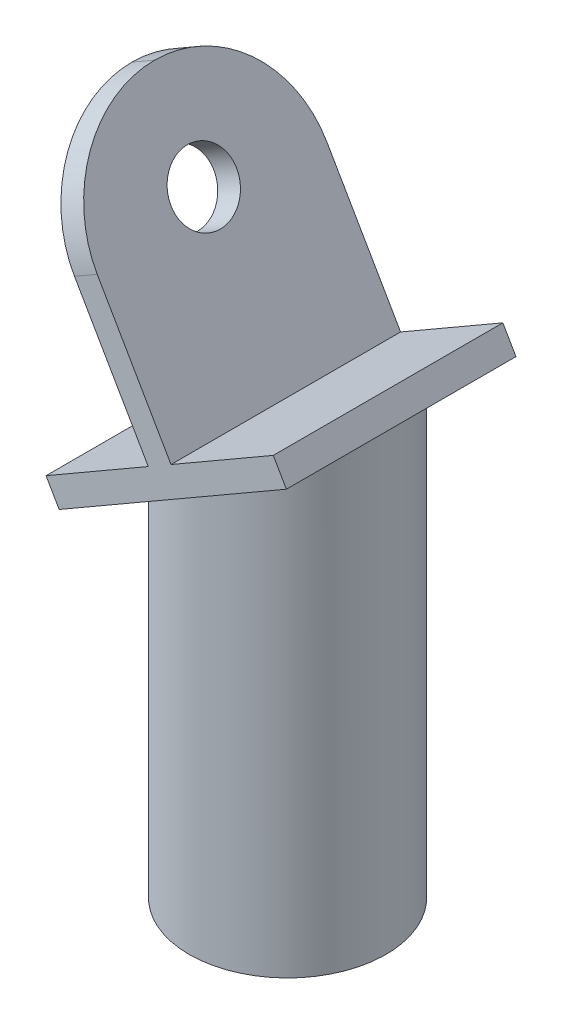
ISO-10303-21;
HEADER;
FILE_DESCRIPTION(('STEP AP214'),'2;1');
FILE_NAME('part.step','',(''),(''),'','','');
FILE_SCHEMA(('AUTOMOTIVE_DESIGN { 1 0 10303 214 1 1 1 1 }'));
ENDSEC;
DATA;
#1=APPLICATION_CONTEXT('core data for automotive mechanical design processes');
#2=APPLICATION_PROTOCOL_DEFINITION('international standard','automotive_design',2000,#1);
#3=PRODUCT_CONTEXT('',#1,'mechanical');
#4=PRODUCT('Part','Part','',(#3));
#5=PRODUCT_RELATED_PRODUCT_CATEGORY('part','',(#4));
#6=PRODUCT_DEFINITION_FORMATION('','',#4);
#7=PRODUCT_DEFINITION_CONTEXT('part definition',#1,'design');
#8=PRODUCT_DEFINITION('design','',#6,#7);
#9=PRODUCT_DEFINITION_SHAPE('','',#8);
#10=(LENGTH_UNIT() NAMED_UNIT(*) SI_UNIT(.MILLI.,.METRE.));
#11=(NAMED_UNIT(*) PLANE_ANGLE_UNIT() SI_UNIT($,.RADIAN.));
#12=(NAMED_UNIT(*) SI_UNIT($,.STERADIAN.) SOLID_ANGLE_UNIT());
#13=UNCERTAINTY_MEASURE_WITH_UNIT(LENGTH_MEASURE(1.E-05),#10,'distance_accuracy_value','');
#14=(GEOMETRIC_REPRESENTATION_CONTEXT(3) GLOBAL_UNCERTAINTY_ASSIGNED_CONTEXT((#13)) GLOBAL_UNIT_ASSIGNED_CONTEXT((#10,
#11,#12)) REPRESENTATION_CONTEXT('',''));
#15=CARTESIAN_POINT('',(0.,0.,0.));
#16=DIRECTION('',(0.,0.,1.));
#17=DIRECTION('',(1.,0.,0.));
#18=AXIS2_PLACEMENT_3D('',#15,#16,#17);
#19=CARTESIAN_POINT('',(-28.5608891324554,49.4689110867544,0.));
#20=DIRECTION('',(-0.500000000000001,0.866025403784438,0.));
#21=DIRECTION('',(-0.866025403784438,-0.500000000000001,0.));
#22=AXIS2_PLACEMENT_3D('',#19,#20,#21);
#23=PLANE('',#22);
#24=DIRECTION('',(0.866025403784438,0.500000000000001,0.));
#25=VECTOR('',#24,1.);
#26=CARTESIAN_POINT('',(-19.3205080756888,54.8038475772933,17.5));
#27=LINE('',#26,#25);
#28=CARTESIAN_POINT('',(-19.3205080756888,54.8038475772933,17.5));
#29=VERTEX_POINT('',#28);
#30=CARTESIAN_POINT('',(-3.73205080756885,63.8038475772934,17.5));
#31=VERTEX_POINT('',#30);
#32=EDGE_CURVE('E121',#29,#31,#27,.T.);
#33=ORIENTED_EDGE('',*,*,#32,.T.);
#34=DIRECTION('',(0.,0.,1.));
#35=VECTOR('',#34,1.);
#36=CARTESIAN_POINT('',(-3.73205080756893,63.8038475772934,-17.5));
#37=LINE('',#36,#35);
#38=CARTESIAN_POINT('',(-3.73205080756893,63.8038475772934,-17.5));
#39=VERTEX_POINT('',#38);
#40=EDGE_CURVE('E103',#39,#31,#37,.T.);
#41=ORIENTED_EDGE('',*,*,#40,.F.);
#42=DIRECTION('',(-0.866025403784438,-0.500000000000001,0.));
#43=VECTOR('',#42,1.);
#44=CARTESIAN_POINT('',(-19.3205080756888,54.8038475772933,-17.5));
#45=LINE('',#44,#43);
#46=CARTESIAN_POINT('',(-19.3205080756888,54.8038475772933,-17.5));
#47=VERTEX_POINT('',#46);
#48=EDGE_CURVE('E110',#39,#47,#45,.T.);
#49=ORIENTED_EDGE('',*,*,#48,.T.);
#50=DIRECTION('',(0.,0.,1.));
#51=VECTOR('',#50,1.);
#52=CARTESIAN_POINT('',(-19.3205080756888,54.8038475772933,-17.5));
#53=LINE('',#52,#51);
#54=EDGE_CURVE('E141',#47,#29,#53,.T.);
#55=ORIENTED_EDGE('',*,*,#54,.T.);
#56=EDGE_LOOP('',(#33,#41,#49,#55));
#57=FACE_BOUND('',#56,.T.);
#58=ADVANCED_FACE('F33',(#57),#23,.T.);
#59=CARTESIAN_POINT('',(15.3205080756887,74.8038475772934,-17.5));
#60=VERTEX_POINT('',#59);
#61=CARTESIAN_POINT('',(-0.267949192431165,65.8038475772933,-17.5));
#62=VERTEX_POINT('',#61);
#63=EDGE_CURVE('E116',#60,#62,#45,.T.);
#64=ORIENTED_EDGE('',*,*,#63,.T.);
#65=DIRECTION('',(0.,0.,-1.));
#66=VECTOR('',#65,1.);
#67=CARTESIAN_POINT('',(-0.267949192431172,65.8038475772934,-17.5));
#68=LINE('',#67,#66);
#69=CARTESIAN_POINT('',(-0.26794919243114,65.8038475772934,17.5));
#70=VERTEX_POINT('',#69);
#71=EDGE_CURVE('E107',#70,#62,#68,.T.);
#72=ORIENTED_EDGE('',*,*,#71,.F.);
#73=CARTESIAN_POINT('',(15.3205080756887,74.8038475772934,17.5));
#74=VERTEX_POINT('',#73);
#75=EDGE_CURVE('E143',#70,#74,#27,.T.);
#76=ORIENTED_EDGE('',*,*,#75,.T.);
#77=DIRECTION('',(0.,0.,-1.));
#78=VECTOR('',#77,1.);
#79=CARTESIAN_POINT('',(15.3205080756887,74.8038475772934,-17.5));
#80=LINE('',#79,#78);
#81=EDGE_CURVE('E117',#74,#60,#80,.T.);
#82=ORIENTED_EDGE('',*,*,#81,.T.);
#83=EDGE_LOOP('',(#64,#72,#76,#82));
#84=FACE_BOUND('',#83,.T.);
#85=ADVANCED_FACE('F215',(#84),#23,.T.);
#86=CARTESIAN_POINT('',(0.,70.,0.));
#87=DIRECTION('',(0.,-1.,0.));
#88=DIRECTION('',(0.,0.,-1.));
#89=AXIS2_PLACEMENT_3D('',#86,#87,#88);
#90=CYLINDRICAL_SURFACE('',#89,15.);
#91=CARTESIAN_POINT('',(0.,0.,0.));
#92=DIRECTION('',(0.,1.,0.));
#93=DIRECTION('',(0.,0.,1.));
#94=AXIS2_PLACEMENT_3D('',#91,#92,#93);
#95=CIRCLE('',#94,15.);
#96=CARTESIAN_POINT('',(0.,0.,15.));
#97=VERTEX_POINT('',#96);
#98=EDGE_CURVE('E171',#97,#97,#95,.T.);
#99=ORIENTED_EDGE('',*,*,#98,.T.);
#100=EDGE_LOOP('',(#99));
#101=FACE_BOUND('',#100,.T.);
#102=CARTESIAN_POINT('',(0.,61.3397459621556,0.));
#103=DIRECTION('',(-0.500000000000001,0.866025403784438,0.));
#104=DIRECTION('',(-0.866025403784438,-0.500000000000001,0.));
#105=AXIS2_PLACEMENT_3D('',#102,#103,#104);
#106=ELLIPSE('',#105,17.3205080756888,15.);
#107=CARTESIAN_POINT('',(-15.,52.6794919243112,0.));
#108=VERTEX_POINT('',#107);
#109=EDGE_CURVE('E165',#108,#108,#106,.T.);
#110=ORIENTED_EDGE('',*,*,#109,.F.);
#111=EDGE_LOOP('',(#110));
#112=FACE_BOUND('',#111,.T.);
#113=ADVANCED_FACE('F219',(#101,#112),#90,.T.);
#114=CARTESIAN_POINT('',(0.,70.,0.));
#115=DIRECTION('',(0.,-1.,0.));
#116=DIRECTION('',(0.,0.,-1.));
#117=AXIS2_PLACEMENT_3D('',#114,#115,#116);
#118=CYLINDRICAL_SURFACE('',#117,13.);
#119=CARTESIAN_POINT('',(0.,0.,0.));
#120=DIRECTION('',(0.,1.,0.));
#121=DIRECTION('',(0.,0.,1.));
#122=AXIS2_PLACEMENT_3D('',#119,#120,#121);
#123=CIRCLE('',#122,13.);
#124=CARTESIAN_POINT('',(0.,0.,13.));
#125=VERTEX_POINT('',#124);
#126=EDGE_CURVE('E168',#125,#125,#123,.T.);
#127=ORIENTED_EDGE('',*,*,#126,.F.);
#128=EDGE_LOOP('',(#127));
#129=FACE_BOUND('',#128,.T.);
#130=CARTESIAN_POINT('',(0.,61.3397459621556,0.));
#131=DIRECTION('',(-0.500000000000001,0.866025403784438,0.));
#132=DIRECTION('',(-0.866025403784438,-0.500000000000001,0.));
#133=AXIS2_PLACEMENT_3D('',#130,#131,#132);
#134=ELLIPSE('',#133,15.0111069989303,13.);
#135=CARTESIAN_POINT('',(-13.,53.8341924626905,0.));
#136=VERTEX_POINT('',#135);
#137=EDGE_CURVE('E162',#136,#136,#134,.T.);
#138=ORIENTED_EDGE('',*,*,#137,.T.);
#139=EDGE_LOOP('',(#138));
#140=FACE_BOUND('',#139,.T.);
#141=ADVANCED_FACE('F234',(#129,#140),#118,.F.);
#142=CARTESIAN_POINT('',(0.,0.,0.));
#143=DIRECTION('',(0.,1.,0.));
#144=DIRECTION('',(0.,0.,1.));
#145=AXIS2_PLACEMENT_3D('',#142,#143,#144);
#146=PLANE('',#145);
#147=ORIENTED_EDGE('',*,*,#98,.F.);
#148=EDGE_LOOP('',(#147));
#149=FACE_BOUND('',#148,.T.);
#150=ORIENTED_EDGE('',*,*,#126,.T.);
#151=EDGE_LOOP('',(#150));
#152=FACE_BOUND('',#151,.T.);
#153=ADVANCED_FACE('F237',(#149,#152),#146,.F.);
#154=CARTESIAN_POINT('',(-26.5608891324554,46.0048094716166,0.));
#155=DIRECTION('',(-0.500000000000001,0.866025403784438,0.));
#156=DIRECTION('',(-0.866025403784438,-0.500000000000001,0.));
#157=AXIS2_PLACEMENT_3D('',#154,#155,#156);
#158=PLANE('',#157);
#159=ORIENTED_EDGE('',*,*,#137,.F.);
#160=EDGE_LOOP('',(#159));
#161=FACE_BOUND('',#160,.T.);
#162=ADVANCED_FACE('F212',(#161),#158,.F.);
#163=CARTESIAN_POINT('',(15.3205080756887,74.8038475772934,-17.5));
#164=DIRECTION('',(-0.866025403784438,-0.500000000000001,0.));
#165=DIRECTION('',(0.500000000000001,-0.866025403784438,0.));
#166=AXIS2_PLACEMENT_3D('',#163,#164,#165);
#167=PLANE('',#166);
#168=DIRECTION('',(0.,0.,-1.));
#169=VECTOR('',#168,1.);
#170=CARTESIAN_POINT('',(17.3205080756887,71.3397459621556,-17.5));
#171=LINE('',#170,#169);
#172=CARTESIAN_POINT('',(17.3205080756888,71.3397459621556,17.5));
#173=VERTEX_POINT('',#172);
#174=CARTESIAN_POINT('',(17.3205080756887,71.3397459621556,-17.5));
#175=VERTEX_POINT('',#174);
#176=EDGE_CURVE('E136',#173,#175,#171,.T.);
#177=ORIENTED_EDGE('',*,*,#176,.T.);
#178=DIRECTION('',(0.500000000000001,-0.866025403784438,0.));
#179=VECTOR('',#178,1.);
#180=CARTESIAN_POINT('',(15.3205080756887,74.8038475772934,-17.5));
#181=LINE('',#180,#179);
#182=EDGE_CURVE('E159',#60,#175,#181,.T.);
#183=ORIENTED_EDGE('',*,*,#182,.F.);
#184=ORIENTED_EDGE('',*,*,#81,.F.);
#185=DIRECTION('',(0.500000000000001,-0.866025403784438,0.));
#186=VECTOR('',#185,1.);
#187=CARTESIAN_POINT('',(15.3205080756887,74.8038475772934,17.5));
#188=LINE('',#187,#186);
#189=EDGE_CURVE('E145',#74,#173,#188,.T.);
#190=ORIENTED_EDGE('',*,*,#189,.T.);
#191=EDGE_LOOP('',(#177,#183,#184,#190));
#192=FACE_BOUND('',#191,.T.);
#193=ADVANCED_FACE('F230',(#192),#167,.F.);
#194=CARTESIAN_POINT('',(-19.3205080756888,54.8038475772933,-17.5));
#195=DIRECTION('',(0.,0.,1.));
#196=DIRECTION('',(1.,0.,0.));
#197=AXIS2_PLACEMENT_3D('',#194,#195,#196);
#198=PLANE('',#197);
#199=DIRECTION('',(0.500000000000001,-0.866025403784438,0.));
#200=VECTOR('',#199,1.);
#201=CARTESIAN_POINT('',(-23.732050807569,98.4448637286709,-17.5));
#202=LINE('',#201,#200);
#203=CARTESIAN_POINT('',(-14.982050807569,83.2894191624433,-17.5));
#204=VERTEX_POINT('',#203);
#205=EDGE_CURVE('E99',#204,#39,#202,.T.);
#206=ORIENTED_EDGE('',*,*,#205,.F.);
#207=DIRECTION('',(-0.866025403784438,-0.500000000000001,0.));
#208=VECTOR('',#207,1.);
#209=CARTESIAN_POINT('',(-30.5705080756888,74.2894191624433,-17.5));
#210=LINE('',#209,#208);
#211=CARTESIAN_POINT('',(-11.5179491924312,85.2894191624433,-17.5));
#212=VERTEX_POINT('',#211);
#213=EDGE_CURVE('E11',#204,#212,#210,.F.);
#214=ORIENTED_EDGE('',*,*,#213,.T.);
#215=DIRECTION('',(0.500000000000001,-0.866025403784438,0.));
#216=VECTOR('',#215,1.);
#217=CARTESIAN_POINT('',(-20.2679491924312,100.444863728671,-17.5));
#218=LINE('',#217,#216);
#219=EDGE_CURVE('E106',#212,#62,#218,.T.);
#220=ORIENTED_EDGE('',*,*,#219,.T.);
#221=ORIENTED_EDGE('',*,*,#63,.F.);
#222=ORIENTED_EDGE('',*,*,#182,.T.);
#223=DIRECTION('',(-0.866025403784438,-0.500000000000001,0.));
#224=VECTOR('',#223,1.);
#225=CARTESIAN_POINT('',(-17.3205080756888,51.3397459621556,-17.5));
#226=LINE('',#225,#224);
#227=CARTESIAN_POINT('',(-17.3205080756888,51.3397459621556,-17.5));
#228=VERTEX_POINT('',#227);
#229=EDGE_CURVE('E148',#175,#228,#226,.T.);
#230=ORIENTED_EDGE('',*,*,#229,.T.);
#231=DIRECTION('',(0.500000000000001,-0.866025403784438,0.));
#232=VECTOR('',#231,1.);
#233=CARTESIAN_POINT('',(-19.3205080756888,54.8038475772933,-17.5));
#234=LINE('',#233,#232);
#235=EDGE_CURVE('E113',#47,#228,#234,.T.);
#236=ORIENTED_EDGE('',*,*,#235,.F.);
#237=ORIENTED_EDGE('',*,*,#48,.F.);
#238=EDGE_LOOP('',(#206,#214,#220,#221,#222,#230,#236,#237));
#239=FACE_BOUND('',#238,.T.);
#240=ADVANCED_FACE('F111',(#239),#198,.F.);
#241=CARTESIAN_POINT('',(-19.3205080756888,54.8038475772933,-17.5));
#242=DIRECTION('',(0.866025403784438,0.500000000000001,0.));
#243=DIRECTION('',(-0.500000000000001,0.866025403784438,0.));
#244=AXIS2_PLACEMENT_3D('',#241,#242,#243);
#245=PLANE('',#244);
#246=DIRECTION('',(0.,0.,1.));
#247=VECTOR('',#246,1.);
#248=CARTESIAN_POINT('',(-17.3205080756888,51.3397459621556,-17.5));
#249=LINE('',#248,#247);
#250=CARTESIAN_POINT('',(-17.3205080756888,51.3397459621556,17.5));
#251=VERTEX_POINT('',#250);
#252=EDGE_CURVE('E150',#228,#251,#249,.T.);
#253=ORIENTED_EDGE('',*,*,#252,.T.);
#254=DIRECTION('',(0.500000000000001,-0.866025403784438,0.));
#255=VECTOR('',#254,1.);
#256=CARTESIAN_POINT('',(-19.3205080756888,54.8038475772933,17.5));
#257=LINE('',#256,#255);
#258=EDGE_CURVE('E155',#29,#251,#257,.T.);
#259=ORIENTED_EDGE('',*,*,#258,.F.);
#260=ORIENTED_EDGE('',*,*,#54,.F.);
#261=ORIENTED_EDGE('',*,*,#235,.T.);
#262=EDGE_LOOP('',(#253,#259,#260,#261));
#263=FACE_BOUND('',#262,.T.);
#264=ADVANCED_FACE('F224',(#263),#245,.F.);
#265=CARTESIAN_POINT('',(-19.3205080756888,54.8038475772933,17.5));
#266=DIRECTION('',(0.,0.,-1.));
#267=DIRECTION('',(-1.,0.,0.));
#268=AXIS2_PLACEMENT_3D('',#265,#266,#267);
#269=PLANE('',#268);
#270=DIRECTION('',(0.500000000000001,-0.866025403784438,0.));
#271=VECTOR('',#270,1.);
#272=CARTESIAN_POINT('',(-20.2679491924312,100.444863728671,17.5));
#273=LINE('',#272,#271);
#274=CARTESIAN_POINT('',(-11.5179491924312,85.2894191624433,17.5));
#275=VERTEX_POINT('',#274);
#276=EDGE_CURVE('E132',#275,#70,#273,.T.);
#277=ORIENTED_EDGE('',*,*,#276,.F.);
#278=DIRECTION('',(0.866025403784438,0.500000000000001,0.));
#279=VECTOR('',#278,1.);
#280=CARTESIAN_POINT('',(-30.5705080756888,74.2894191624433,17.5));
#281=LINE('',#280,#279);
#282=CARTESIAN_POINT('',(-14.982050807569,83.2894191624433,17.5));
#283=VERTEX_POINT('',#282);
#284=EDGE_CURVE('E178',#275,#283,#281,.F.);
#285=ORIENTED_EDGE('',*,*,#284,.T.);
#286=DIRECTION('',(0.500000000000001,-0.866025403784438,0.));
#287=VECTOR('',#286,1.);
#288=CARTESIAN_POINT('',(-23.732050807569,98.4448637286709,17.5));
#289=LINE('',#288,#287);
#290=EDGE_CURVE('E134',#283,#31,#289,.T.);
#291=ORIENTED_EDGE('',*,*,#290,.T.);
#292=ORIENTED_EDGE('',*,*,#32,.F.);
#293=ORIENTED_EDGE('',*,*,#258,.T.);
#294=DIRECTION('',(0.866025403784438,0.500000000000001,0.));
#295=VECTOR('',#294,1.);
#296=CARTESIAN_POINT('',(-17.3205080756888,51.3397459621556,17.5));
#297=LINE('',#296,#295);
#298=EDGE_CURVE('E138',#251,#173,#297,.T.);
#299=ORIENTED_EDGE('',*,*,#298,.T.);
#300=ORIENTED_EDGE('',*,*,#189,.F.);
#301=ORIENTED_EDGE('',*,*,#75,.F.);
#302=EDGE_LOOP('',(#277,#285,#291,#292,#293,#299,#300,#301));
#303=FACE_BOUND('',#302,.T.);
#304=ADVANCED_FACE('F185',(#303),#269,.F.);
#305=ORIENTED_EDGE('',*,*,#109,.T.);
#306=EDGE_LOOP('',(#305));
#307=FACE_BOUND('',#306,.T.);
#308=ORIENTED_EDGE('',*,*,#176,.F.);
#309=ORIENTED_EDGE('',*,*,#298,.F.);
#310=ORIENTED_EDGE('',*,*,#252,.F.);
#311=ORIENTED_EDGE('',*,*,#229,.F.);
#312=EDGE_LOOP('',(#308,#309,#310,#311));
#313=FACE_BOUND('',#312,.T.);
#314=ADVANCED_FACE('F202',(#307,#313),#158,.F.);
#315=CARTESIAN_POINT('',(-23.732050807569,98.4448637286709,-17.5));
#316=DIRECTION('',(0.866025403784438,0.500000000000001,0.));
#317=DIRECTION('',(-0.500000000000001,0.866025403784438,0.));
#318=AXIS2_PLACEMENT_3D('',#315,#316,#317);
#319=PLANE('',#318);
#320=CARTESIAN_POINT('',(-16.232050807569,85.4544826719044,0.));
#321=DIRECTION('',(-0.866025403784438,-0.500000000000001,0.));
#322=DIRECTION('',(0.500000000000001,-0.866025403784438,0.));
#323=AXIS2_PLACEMENT_3D('',#320,#321,#322);
#324=CIRCLE('',#323,5.);
#325=CARTESIAN_POINT('',(-13.7320508075689,81.1243556529822,0.));
#326=VERTEX_POINT('',#325);
#327=EDGE_CURVE('E127',#326,#326,#324,.T.);
#328=ORIENTED_EDGE('',*,*,#327,.F.);
#329=EDGE_LOOP('',(#328));
#330=FACE_BOUND('',#329,.T.);
#331=ORIENTED_EDGE('',*,*,#290,.F.);
#332=CARTESIAN_POINT('',(-14.982050807569,83.2894191624433,0.));
#333=DIRECTION('',(0.866025403784438,0.500000000000001,0.));
#334=DIRECTION('',(-0.500000000000001,0.866025403784438,0.));
#335=AXIS2_PLACEMENT_3D('',#332,#333,#334);
#336=CIRCLE('',#335,17.5);
#337=CARTESIAN_POINT('',(-23.732050807569,98.4448637286709,0.));
#338=VERTEX_POINT('',#337);
#339=EDGE_CURVE('E42',#283,#338,#336,.F.);
#340=ORIENTED_EDGE('',*,*,#339,.T.);
#341=CARTESIAN_POINT('',(-14.982050807569,83.2894191624433,0.));
#342=DIRECTION('',(0.866025403784438,0.500000000000001,0.));
#343=DIRECTION('',(-0.500000000000001,0.866025403784438,0.));
#344=AXIS2_PLACEMENT_3D('',#341,#342,#343);
#345=CIRCLE('',#344,17.5);
#346=EDGE_CURVE('E49',#338,#204,#345,.F.);
#347=ORIENTED_EDGE('',*,*,#346,.T.);
#348=ORIENTED_EDGE('',*,*,#205,.T.);
#349=ORIENTED_EDGE('',*,*,#40,.T.);
#350=EDGE_LOOP('',(#331,#340,#347,#348,#349));
#351=FACE_BOUND('',#350,.T.);
#352=ADVANCED_FACE('F101',(#330,#351),#319,.F.);
#353=CARTESIAN_POINT('',(-20.2679491924312,100.444863728671,-17.5));
#354=DIRECTION('',(-0.866025403784438,-0.500000000000001,0.));
#355=DIRECTION('',(0.500000000000001,-0.866025403784438,0.));
#356=AXIS2_PLACEMENT_3D('',#353,#354,#355);
#357=PLANE('',#356);
#358=CARTESIAN_POINT('',(-12.7679491924312,87.4544826719044,0.));
#359=DIRECTION('',(-0.866025403784438,-0.500000000000001,0.));
#360=DIRECTION('',(0.500000000000001,-0.866025403784438,0.));
#361=AXIS2_PLACEMENT_3D('',#358,#359,#360);
#362=CIRCLE('',#361,5.);
#363=CARTESIAN_POINT('',(-10.2679491924312,83.1243556529822,0.));
#364=VERTEX_POINT('',#363);
#365=EDGE_CURVE('E122',#364,#364,#362,.T.);
#366=ORIENTED_EDGE('',*,*,#365,.T.);
#367=EDGE_LOOP('',(#366));
#368=FACE_BOUND('',#367,.T.);
#369=CARTESIAN_POINT('',(-11.5179491924312,85.2894191624433,0.));
#370=DIRECTION('',(-0.866025403784438,-0.500000000000001,0.));
#371=DIRECTION('',(0.500000000000001,-0.866025403784438,0.));
#372=AXIS2_PLACEMENT_3D('',#369,#370,#371);
#373=CIRCLE('',#372,17.5);
#374=CARTESIAN_POINT('',(-20.2679491924312,100.444863728671,0.));
#375=VERTEX_POINT('',#374);
#376=EDGE_CURVE('E173',#212,#375,#373,.F.);
#377=ORIENTED_EDGE('',*,*,#376,.T.);
#378=CARTESIAN_POINT('',(-11.5179491924312,85.2894191624433,0.));
#379=DIRECTION('',(-0.866025403784438,-0.500000000000001,0.));
#380=DIRECTION('',(0.500000000000001,-0.866025403784438,0.));
#381=AXIS2_PLACEMENT_3D('',#378,#379,#380);
#382=CIRCLE('',#381,17.5);
#383=EDGE_CURVE('E176',#375,#275,#382,.F.);
#384=ORIENTED_EDGE('',*,*,#383,.T.);
#385=ORIENTED_EDGE('',*,*,#276,.T.);
#386=ORIENTED_EDGE('',*,*,#71,.T.);
#387=ORIENTED_EDGE('',*,*,#219,.F.);
#388=EDGE_LOOP('',(#377,#384,#385,#386,#387));
#389=FACE_BOUND('',#388,.T.);
#390=ADVANCED_FACE('F201',(#368,#389),#357,.F.);
#391=CARTESIAN_POINT('',(15.4233937586587,103.730762113533,0.));
#392=DIRECTION('',(-0.866025403784438,-0.500000000000001,0.));
#393=DIRECTION('',(0.500000000000001,-0.866025403784438,0.));
#394=AXIS2_PLACEMENT_3D('',#391,#392,#393);
#395=CYLINDRICAL_SURFACE('',#394,5.);
#396=ORIENTED_EDGE('',*,*,#327,.T.);
#397=EDGE_LOOP('',(#396));
#398=FACE_BOUND('',#397,.T.);
#399=ORIENTED_EDGE('',*,*,#365,.F.);
#400=EDGE_LOOP('',(#399));
#401=FACE_BOUND('',#400,.T.);
#402=ADVANCED_FACE('F197',(#398,#401),#395,.F.);
#403=CARTESIAN_POINT('',(-39.8108891324554,68.9544826719043,0.));
#404=DIRECTION('',(-0.866025403784438,-0.500000000000001,0.));
#405=DIRECTION('',(0.500000000000001,-0.866025403784438,0.));
#406=AXIS2_PLACEMENT_3D('',#403,#404,#405);
#407=CYLINDRICAL_SURFACE('',#406,17.5);
#408=ORIENTED_EDGE('',*,*,#213,.F.);
#409=ORIENTED_EDGE('',*,*,#346,.F.);
#410=DIRECTION('',(-0.866025403784438,-0.500000000000001,0.));
#411=VECTOR('',#410,1.);
#412=CARTESIAN_POINT('',(-48.5608891324555,84.109927238132,0.));
#413=LINE('',#412,#411);
#414=EDGE_CURVE('E37',#375,#338,#413,.T.);
#415=ORIENTED_EDGE('',*,*,#414,.F.);
#416=ORIENTED_EDGE('',*,*,#376,.F.);
#417=EDGE_LOOP('',(#408,#409,#415,#416));
#418=FACE_BOUND('',#417,.T.);
#419=ADVANCED_FACE('F35',(#418),#407,.T.);
#420=CARTESIAN_POINT('',(-39.8108891324554,68.9544826719043,0.));
#421=DIRECTION('',(0.866025403784438,0.500000000000001,0.));
#422=DIRECTION('',(-0.500000000000001,0.866025403784438,0.));
#423=AXIS2_PLACEMENT_3D('',#420,#421,#422);
#424=CYLINDRICAL_SURFACE('',#423,17.5);
#425=ORIENTED_EDGE('',*,*,#339,.F.);
#426=ORIENTED_EDGE('',*,*,#284,.F.);
#427=ORIENTED_EDGE('',*,*,#383,.F.);
#428=ORIENTED_EDGE('',*,*,#414,.T.);
#429=EDGE_LOOP('',(#425,#426,#427,#428));
#430=FACE_BOUND('',#429,.T.);
#431=ADVANCED_FACE('F189',(#430),#424,.T.);
#432=CLOSED_SHELL('',(#58,#85,#113,#141,#153,#162,#193,#240,#264,#304,#314,#352,#390,#402,#419,#431));
#433=MANIFOLD_SOLID_BREP('B2',#432);
#434=ADVANCED_BREP_SHAPE_REPRESENTATION('',(#18,#433),#14);
#435=SHAPE_DEFINITION_REPRESENTATION(#9,#434);
ENDSEC;
END-ISO-10303-21;
